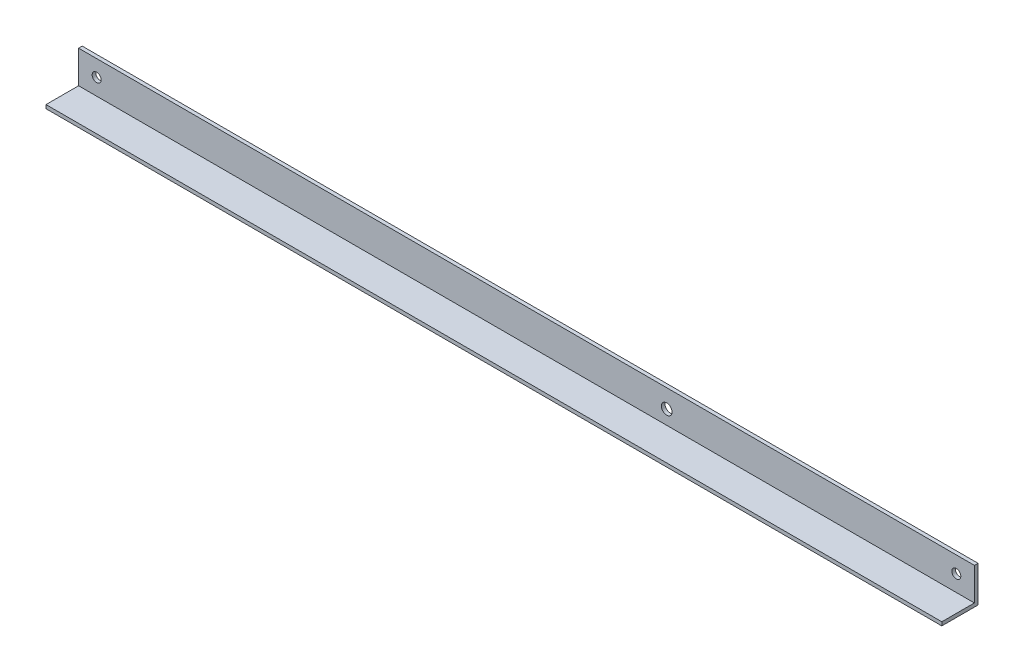
ISO-10303-21;
HEADER;
FILE_DESCRIPTION(('STEP AP214'),'2;1');
FILE_NAME('part.step','',(''),(''),'','','');
FILE_SCHEMA(('AUTOMOTIVE_DESIGN { 1 0 10303 214 1 1 1 1 }'));
ENDSEC;
DATA;
#1=APPLICATION_CONTEXT('core data for automotive mechanical design processes');
#2=APPLICATION_PROTOCOL_DEFINITION('international standard','automotive_design',2000,#1);
#3=PRODUCT_CONTEXT('',#1,'mechanical');
#4=PRODUCT('Part','Part','',(#3));
#5=PRODUCT_RELATED_PRODUCT_CATEGORY('part','',(#4));
#6=PRODUCT_DEFINITION_FORMATION('','',#4);
#7=PRODUCT_DEFINITION_CONTEXT('part definition',#1,'design');
#8=PRODUCT_DEFINITION('design','',#6,#7);
#9=PRODUCT_DEFINITION_SHAPE('','',#8);
#10=(LENGTH_UNIT() NAMED_UNIT(*) SI_UNIT(.MILLI.,.METRE.));
#11=(NAMED_UNIT(*) PLANE_ANGLE_UNIT() SI_UNIT($,.RADIAN.));
#12=(NAMED_UNIT(*) SI_UNIT($,.STERADIAN.) SOLID_ANGLE_UNIT());
#13=UNCERTAINTY_MEASURE_WITH_UNIT(LENGTH_MEASURE(1.E-05),#10,'distance_accuracy_value','');
#14=(GEOMETRIC_REPRESENTATION_CONTEXT(3) GLOBAL_UNCERTAINTY_ASSIGNED_CONTEXT((#13)) GLOBAL_UNIT_ASSIGNED_CONTEXT((#10,
#11,#12)) REPRESENTATION_CONTEXT('',''));
#15=CARTESIAN_POINT('',(0.,0.,0.));
#16=DIRECTION('',(0.,0.,1.));
#17=DIRECTION('',(1.,0.,0.));
#18=AXIS2_PLACEMENT_3D('',#15,#16,#17);
#19=CARTESIAN_POINT('',(-325.,20.,2.));
#20=DIRECTION('',(0.,1.,0.));
#21=DIRECTION('',(0.,0.,1.));
#22=AXIS2_PLACEMENT_3D('',#19,#20,#21);
#23=PLANE('',#22);
#24=DIRECTION('',(1.,0.,0.));
#25=VECTOR('',#24,1.);
#26=CARTESIAN_POINT('',(-325.,20.,2.));
#27=LINE('',#26,#25);
#28=CARTESIAN_POINT('',(-325.,20.,2.));
#29=VERTEX_POINT('',#28);
#30=CARTESIAN_POINT('',(170.,20.,2.));
#31=VERTEX_POINT('',#30);
#32=EDGE_CURVE('E45',#29,#31,#27,.T.);
#33=ORIENTED_EDGE('',*,*,#32,.T.);
#34=DIRECTION('',(0.,0.,1.));
#35=VECTOR('',#34,1.);
#36=CARTESIAN_POINT('',(170.,20.,2.));
#37=LINE('',#36,#35);
#38=CARTESIAN_POINT('',(170.,20.,0.));
#39=VERTEX_POINT('',#38);
#40=EDGE_CURVE('E95',#39,#31,#37,.T.);
#41=ORIENTED_EDGE('',*,*,#40,.F.);
#42=DIRECTION('',(1.,0.,0.));
#43=VECTOR('',#42,1.);
#44=CARTESIAN_POINT('',(-325.,20.,0.));
#45=LINE('',#44,#43);
#46=CARTESIAN_POINT('',(-325.,20.,0.));
#47=VERTEX_POINT('',#46);
#48=EDGE_CURVE('E11',#47,#39,#45,.T.);
#49=ORIENTED_EDGE('',*,*,#48,.F.);
#50=DIRECTION('',(0.,0.,1.));
#51=VECTOR('',#50,1.);
#52=CARTESIAN_POINT('',(-325.,20.,2.));
#53=LINE('',#52,#51);
#54=EDGE_CURVE('E96',#47,#29,#53,.T.);
#55=ORIENTED_EDGE('',*,*,#54,.T.);
#56=EDGE_LOOP('',(#33,#41,#49,#55));
#57=FACE_BOUND('',#56,.T.);
#58=ADVANCED_FACE('F42',(#57),#23,.T.);
#59=CARTESIAN_POINT('',(-325.,20.,0.));
#60=DIRECTION('',(0.,0.,-1.));
#61=DIRECTION('',(-1.,0.,0.));
#62=AXIS2_PLACEMENT_3D('',#59,#60,#61);
#63=PLANE('',#62);
#64=CARTESIAN_POINT('',(-315.,11.,0.));
#65=DIRECTION('',(0.,0.,1.));
#66=DIRECTION('',(1.,0.,0.));
#67=AXIS2_PLACEMENT_3D('',#64,#65,#66);
#68=CIRCLE('',#67,2.50000000000002);
#69=CARTESIAN_POINT('',(-312.5,11.,0.));
#70=VERTEX_POINT('',#69);
#71=EDGE_CURVE('E220',#70,#70,#68,.T.);
#72=ORIENTED_EDGE('',*,*,#71,.T.);
#73=EDGE_LOOP('',(#72));
#74=FACE_BOUND('',#73,.T.);
#75=CARTESIAN_POINT('',(160.,11.,0.));
#76=DIRECTION('',(0.,0.,1.));
#77=DIRECTION('',(1.,0.,0.));
#78=AXIS2_PLACEMENT_3D('',#75,#76,#77);
#79=CIRCLE('',#78,2.5);
#80=CARTESIAN_POINT('',(162.5,11.,0.));
#81=VERTEX_POINT('',#80);
#82=EDGE_CURVE('E211',#81,#81,#79,.T.);
#83=ORIENTED_EDGE('',*,*,#82,.T.);
#84=EDGE_LOOP('',(#83));
#85=FACE_BOUND('',#84,.T.);
#86=CARTESIAN_POINT('',(0.,9.8,0.));
#87=DIRECTION('',(0.,0.,1.));
#88=DIRECTION('',(1.,0.,0.));
#89=AXIS2_PLACEMENT_3D('',#86,#87,#88);
#90=CIRCLE('',#89,2.95);
#91=CARTESIAN_POINT('',(2.95,9.8,0.));
#92=VERTEX_POINT('',#91);
#93=EDGE_CURVE('E117',#92,#92,#90,.T.);
#94=ORIENTED_EDGE('',*,*,#93,.T.);
#95=EDGE_LOOP('',(#94));
#96=FACE_BOUND('',#95,.T.);
#97=ORIENTED_EDGE('',*,*,#48,.T.);
#98=DIRECTION('',(0.,1.,0.));
#99=VECTOR('',#98,1.);
#100=CARTESIAN_POINT('',(170.,20.,0.));
#101=LINE('',#100,#99);
#102=CARTESIAN_POINT('',(170.,0.,0.));
#103=VERTEX_POINT('',#102);
#104=EDGE_CURVE('E115',#103,#39,#101,.T.);
#105=ORIENTED_EDGE('',*,*,#104,.F.);
#106=DIRECTION('',(1.,0.,0.));
#107=VECTOR('',#106,1.);
#108=CARTESIAN_POINT('',(-325.,0.,0.));
#109=LINE('',#108,#107);
#110=CARTESIAN_POINT('',(-325.,0.,0.));
#111=VERTEX_POINT('',#110);
#112=EDGE_CURVE('E51',#111,#103,#109,.T.);
#113=ORIENTED_EDGE('',*,*,#112,.F.);
#114=DIRECTION('',(0.,1.,0.));
#115=VECTOR('',#114,1.);
#116=CARTESIAN_POINT('',(-325.,20.,0.));
#117=LINE('',#116,#115);
#118=EDGE_CURVE('E102',#111,#47,#117,.T.);
#119=ORIENTED_EDGE('',*,*,#118,.T.);
#120=EDGE_LOOP('',(#97,#105,#113,#119));
#121=FACE_BOUND('',#120,.T.);
#122=ADVANCED_FACE('F176',(#74,#85,#96,#121),#63,.T.);
#123=CARTESIAN_POINT('',(-325.,0.,0.));
#124=DIRECTION('',(0.,-1.,0.));
#125=DIRECTION('',(0.,0.,-1.));
#126=AXIS2_PLACEMENT_3D('',#123,#124,#125);
#127=PLANE('',#126);
#128=ORIENTED_EDGE('',*,*,#112,.T.);
#129=DIRECTION('',(0.,0.,-1.));
#130=VECTOR('',#129,1.);
#131=CARTESIAN_POINT('',(170.,0.,0.));
#132=LINE('',#131,#130);
#133=CARTESIAN_POINT('',(170.,0.,20.));
#134=VERTEX_POINT('',#133);
#135=EDGE_CURVE('E131',#134,#103,#132,.T.);
#136=ORIENTED_EDGE('',*,*,#135,.F.);
#137=DIRECTION('',(1.,0.,0.));
#138=VECTOR('',#137,1.);
#139=CARTESIAN_POINT('',(-325.,0.,20.));
#140=LINE('',#139,#138);
#141=CARTESIAN_POINT('',(-325.,0.,20.));
#142=VERTEX_POINT('',#141);
#143=EDGE_CURVE('E156',#142,#134,#140,.T.);
#144=ORIENTED_EDGE('',*,*,#143,.F.);
#145=DIRECTION('',(0.,0.,-1.));
#146=VECTOR('',#145,1.);
#147=CARTESIAN_POINT('',(-325.,0.,0.));
#148=LINE('',#147,#146);
#149=EDGE_CURVE('E149',#142,#111,#148,.T.);
#150=ORIENTED_EDGE('',*,*,#149,.T.);
#151=EDGE_LOOP('',(#128,#136,#144,#150));
#152=FACE_BOUND('',#151,.T.);
#153=ADVANCED_FACE('F172',(#152),#127,.T.);
#154=CARTESIAN_POINT('',(-325.,0.,20.));
#155=DIRECTION('',(0.,0.,1.));
#156=DIRECTION('',(1.,0.,0.));
#157=AXIS2_PLACEMENT_3D('',#154,#155,#156);
#158=PLANE('',#157);
#159=ORIENTED_EDGE('',*,*,#143,.T.);
#160=DIRECTION('',(0.,-1.,0.));
#161=VECTOR('',#160,1.);
#162=CARTESIAN_POINT('',(170.,0.,20.));
#163=LINE('',#162,#161);
#164=CARTESIAN_POINT('',(170.,2.,20.));
#165=VERTEX_POINT('',#164);
#166=EDGE_CURVE('E127',#165,#134,#163,.T.);
#167=ORIENTED_EDGE('',*,*,#166,.F.);
#168=DIRECTION('',(1.,0.,0.));
#169=VECTOR('',#168,1.);
#170=CARTESIAN_POINT('',(-325.,2.,20.));
#171=LINE('',#170,#169);
#172=CARTESIAN_POINT('',(-325.,2.,20.));
#173=VERTEX_POINT('',#172);
#174=EDGE_CURVE('E159',#173,#165,#171,.T.);
#175=ORIENTED_EDGE('',*,*,#174,.F.);
#176=DIRECTION('',(0.,-1.,0.));
#177=VECTOR('',#176,1.);
#178=CARTESIAN_POINT('',(-325.,0.,20.));
#179=LINE('',#178,#177);
#180=EDGE_CURVE('E145',#173,#142,#179,.T.);
#181=ORIENTED_EDGE('',*,*,#180,.T.);
#182=EDGE_LOOP('',(#159,#167,#175,#181));
#183=FACE_BOUND('',#182,.T.);
#184=ADVANCED_FACE('F169',(#183),#158,.T.);
#185=CARTESIAN_POINT('',(-325.,2.,20.));
#186=DIRECTION('',(0.,1.,0.));
#187=DIRECTION('',(0.,0.,1.));
#188=AXIS2_PLACEMENT_3D('',#185,#186,#187);
#189=PLANE('',#188);
#190=ORIENTED_EDGE('',*,*,#174,.T.);
#191=DIRECTION('',(0.,0.,1.));
#192=VECTOR('',#191,1.);
#193=CARTESIAN_POINT('',(170.,2.,20.));
#194=LINE('',#193,#192);
#195=CARTESIAN_POINT('',(170.,2.,2.));
#196=VERTEX_POINT('',#195);
#197=EDGE_CURVE('E110',#196,#165,#194,.T.);
#198=ORIENTED_EDGE('',*,*,#197,.F.);
#199=DIRECTION('',(1.,0.,0.));
#200=VECTOR('',#199,1.);
#201=CARTESIAN_POINT('',(-325.,2.,2.));
#202=LINE('',#201,#200);
#203=CARTESIAN_POINT('',(-325.,2.,2.));
#204=VERTEX_POINT('',#203);
#205=EDGE_CURVE('E101',#204,#196,#202,.T.);
#206=ORIENTED_EDGE('',*,*,#205,.F.);
#207=DIRECTION('',(0.,0.,1.));
#208=VECTOR('',#207,1.);
#209=CARTESIAN_POINT('',(-325.,2.,20.));
#210=LINE('',#209,#208);
#211=EDGE_CURVE('E141',#204,#173,#210,.T.);
#212=ORIENTED_EDGE('',*,*,#211,.T.);
#213=EDGE_LOOP('',(#190,#198,#206,#212));
#214=FACE_BOUND('',#213,.T.);
#215=ADVANCED_FACE('F163',(#214),#189,.T.);
#216=CARTESIAN_POINT('',(-325.,2.,2.));
#217=DIRECTION('',(0.,0.,1.));
#218=DIRECTION('',(0.,-1.,0.));
#219=AXIS2_PLACEMENT_3D('',#216,#217,#218);
#220=PLANE('',#219);
#221=CARTESIAN_POINT('',(-315.,11.,2.));
#222=DIRECTION('',(0.,0.,1.));
#223=DIRECTION('',(1.,0.,0.));
#224=AXIS2_PLACEMENT_3D('',#221,#222,#223);
#225=CIRCLE('',#224,2.50000000000002);
#226=CARTESIAN_POINT('',(-312.5,11.,2.));
#227=VERTEX_POINT('',#226);
#228=EDGE_CURVE('E201',#227,#227,#225,.T.);
#229=ORIENTED_EDGE('',*,*,#228,.F.);
#230=EDGE_LOOP('',(#229));
#231=FACE_BOUND('',#230,.T.);
#232=CARTESIAN_POINT('',(160.,11.,2.));
#233=DIRECTION('',(0.,0.,1.));
#234=DIRECTION('',(1.,0.,0.));
#235=AXIS2_PLACEMENT_3D('',#232,#233,#234);
#236=CIRCLE('',#235,2.5);
#237=CARTESIAN_POINT('',(162.5,11.,2.));
#238=VERTEX_POINT('',#237);
#239=EDGE_CURVE('E205',#238,#238,#236,.T.);
#240=ORIENTED_EDGE('',*,*,#239,.F.);
#241=EDGE_LOOP('',(#240));
#242=FACE_BOUND('',#241,.T.);
#243=CARTESIAN_POINT('',(0.,9.8,2.));
#244=DIRECTION('',(0.,0.,1.));
#245=DIRECTION('',(1.,0.,0.));
#246=AXIS2_PLACEMENT_3D('',#243,#244,#245);
#247=CIRCLE('',#246,2.95);
#248=CARTESIAN_POINT('',(2.95,9.8,2.));
#249=VERTEX_POINT('',#248);
#250=EDGE_CURVE('E121',#249,#249,#247,.T.);
#251=ORIENTED_EDGE('',*,*,#250,.F.);
#252=EDGE_LOOP('',(#251));
#253=FACE_BOUND('',#252,.T.);
#254=ORIENTED_EDGE('',*,*,#205,.T.);
#255=DIRECTION('',(0.,-1.,0.));
#256=VECTOR('',#255,1.);
#257=CARTESIAN_POINT('',(170.,2.,2.));
#258=LINE('',#257,#256);
#259=EDGE_CURVE('E104',#31,#196,#258,.T.);
#260=ORIENTED_EDGE('',*,*,#259,.F.);
#261=ORIENTED_EDGE('',*,*,#32,.F.);
#262=DIRECTION('',(0.,-1.,0.));
#263=VECTOR('',#262,1.);
#264=CARTESIAN_POINT('',(-325.,2.,2.));
#265=LINE('',#264,#263);
#266=EDGE_CURVE('E138',#29,#204,#265,.T.);
#267=ORIENTED_EDGE('',*,*,#266,.T.);
#268=EDGE_LOOP('',(#254,#260,#261,#267));
#269=FACE_BOUND('',#268,.T.);
#270=ADVANCED_FACE('F105',(#231,#242,#253,#269),#220,.T.);
#271=CARTESIAN_POINT('',(-325.,0.,0.));
#272=DIRECTION('',(-1.,0.,0.));
#273=DIRECTION('',(0.,0.,1.));
#274=AXIS2_PLACEMENT_3D('',#271,#272,#273);
#275=PLANE('',#274);
#276=ORIENTED_EDGE('',*,*,#54,.F.);
#277=ORIENTED_EDGE('',*,*,#118,.F.);
#278=ORIENTED_EDGE('',*,*,#149,.F.);
#279=ORIENTED_EDGE('',*,*,#180,.F.);
#280=ORIENTED_EDGE('',*,*,#211,.F.);
#281=ORIENTED_EDGE('',*,*,#266,.F.);
#282=EDGE_LOOP('',(#276,#277,#278,#279,#280,#281));
#283=FACE_BOUND('',#282,.T.);
#284=ADVANCED_FACE('F175',(#283),#275,.T.);
#285=CARTESIAN_POINT('',(170.,0.,0.));
#286=DIRECTION('',(-1.,0.,0.));
#287=DIRECTION('',(0.,0.,1.));
#288=AXIS2_PLACEMENT_3D('',#285,#286,#287);
#289=PLANE('',#288);
#290=ORIENTED_EDGE('',*,*,#40,.T.);
#291=ORIENTED_EDGE('',*,*,#259,.T.);
#292=ORIENTED_EDGE('',*,*,#197,.T.);
#293=ORIENTED_EDGE('',*,*,#166,.T.);
#294=ORIENTED_EDGE('',*,*,#135,.T.);
#295=ORIENTED_EDGE('',*,*,#104,.T.);
#296=EDGE_LOOP('',(#290,#291,#292,#293,#294,#295));
#297=FACE_BOUND('',#296,.T.);
#298=ADVANCED_FACE('F113',(#297),#289,.F.);
#299=CARTESIAN_POINT('',(0.,9.8,0.));
#300=DIRECTION('',(0.,0.,1.));
#301=DIRECTION('',(1.,0.,0.));
#302=AXIS2_PLACEMENT_3D('',#299,#300,#301);
#303=CYLINDRICAL_SURFACE('',#302,2.95);
#304=ORIENTED_EDGE('',*,*,#93,.F.);
#305=EDGE_LOOP('',(#304));
#306=FACE_BOUND('',#305,.T.);
#307=ORIENTED_EDGE('',*,*,#250,.T.);
#308=EDGE_LOOP('',(#307));
#309=FACE_BOUND('',#308,.T.);
#310=ADVANCED_FACE('F232',(#306,#309),#303,.F.);
#311=CARTESIAN_POINT('',(160.,11.,0.));
#312=DIRECTION('',(0.,0.,1.));
#313=DIRECTION('',(1.,0.,0.));
#314=AXIS2_PLACEMENT_3D('',#311,#312,#313);
#315=CYLINDRICAL_SURFACE('',#314,2.5);
#316=ORIENTED_EDGE('',*,*,#82,.F.);
#317=EDGE_LOOP('',(#316));
#318=FACE_BOUND('',#317,.T.);
#319=ORIENTED_EDGE('',*,*,#239,.T.);
#320=EDGE_LOOP('',(#319));
#321=FACE_BOUND('',#320,.T.);
#322=ADVANCED_FACE('F227',(#318,#321),#315,.F.);
#323=CARTESIAN_POINT('',(-315.,11.,0.));
#324=DIRECTION('',(0.,0.,1.));
#325=DIRECTION('',(1.,0.,0.));
#326=AXIS2_PLACEMENT_3D('',#323,#324,#325);
#327=CYLINDRICAL_SURFACE('',#326,2.50000000000002);
#328=ORIENTED_EDGE('',*,*,#71,.F.);
#329=EDGE_LOOP('',(#328));
#330=FACE_BOUND('',#329,.T.);
#331=ORIENTED_EDGE('',*,*,#228,.T.);
#332=EDGE_LOOP('',(#331));
#333=FACE_BOUND('',#332,.T.);
#334=ADVANCED_FACE('F224',(#330,#333),#327,.F.);
#335=CLOSED_SHELL('',(#58,#122,#153,#184,#215,#270,#284,#298,#310,#322,#334));
#336=MANIFOLD_SOLID_BREP('B2',#335);
#337=ADVANCED_BREP_SHAPE_REPRESENTATION('',(#18,#336),#14);
#338=SHAPE_DEFINITION_REPRESENTATION(#9,#337);
ENDSEC;
END-ISO-10303-21;
